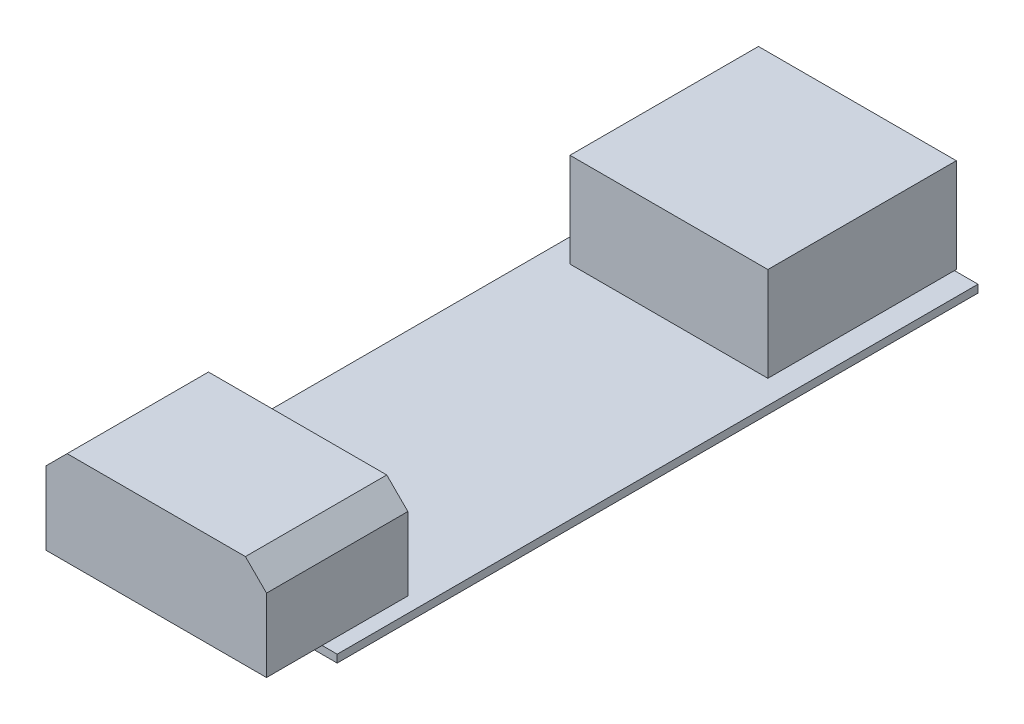
ISO-10303-21;
HEADER;
FILE_DESCRIPTION(('STEP AP214'),'2;1');
FILE_NAME('part.step','',(''),(''),'','','');
FILE_SCHEMA(('AUTOMOTIVE_DESIGN { 1 0 10303 214 1 1 1 1 }'));
ENDSEC;
DATA;
#1=APPLICATION_CONTEXT('core data for automotive mechanical design processes');
#2=APPLICATION_PROTOCOL_DEFINITION('international standard','automotive_design',2000,#1);
#3=PRODUCT_CONTEXT('',#1,'mechanical');
#4=PRODUCT('Part','Part','',(#3));
#5=PRODUCT_RELATED_PRODUCT_CATEGORY('part','',(#4));
#6=PRODUCT_DEFINITION_FORMATION('','',#4);
#7=PRODUCT_DEFINITION_CONTEXT('part definition',#1,'design');
#8=PRODUCT_DEFINITION('design','',#6,#7);
#9=PRODUCT_DEFINITION_SHAPE('','',#8);
#10=(LENGTH_UNIT() NAMED_UNIT(*) SI_UNIT(.MILLI.,.METRE.));
#11=(NAMED_UNIT(*) PLANE_ANGLE_UNIT() SI_UNIT($,.RADIAN.));
#12=(NAMED_UNIT(*) SI_UNIT($,.STERADIAN.) SOLID_ANGLE_UNIT());
#13=UNCERTAINTY_MEASURE_WITH_UNIT(LENGTH_MEASURE(1.E-05),#10,'distance_accuracy_value','');
#14=(GEOMETRIC_REPRESENTATION_CONTEXT(3) GLOBAL_UNCERTAINTY_ASSIGNED_CONTEXT((#13)) GLOBAL_UNIT_ASSIGNED_CONTEXT((#10,
#11,#12)) REPRESENTATION_CONTEXT('',''));
#15=CARTESIAN_POINT('',(0.,0.,0.));
#16=DIRECTION('',(0.,0.,1.));
#17=DIRECTION('',(1.,0.,0.));
#18=AXIS2_PLACEMENT_3D('',#15,#16,#17);
#19=CARTESIAN_POINT('',(0.,0.,0.));
#20=DIRECTION('',(0.,-1.,0.));
#21=DIRECTION('',(0.,0.,-1.));
#22=AXIS2_PLACEMENT_3D('',#19,#20,#21);
#23=PLANE('',#22);
#24=DIRECTION('',(0.,0.,1.));
#25=VECTOR('',#24,1.);
#26=CARTESIAN_POINT('',(0.750000000000004,0.,0.));
#27=LINE('',#26,#25);
#28=CARTESIAN_POINT('',(0.75,0.,-29.45));
#29=VERTEX_POINT('',#28);
#30=CARTESIAN_POINT('',(0.750000000000001,0.,-19.55));
#31=VERTEX_POINT('',#30);
#32=EDGE_CURVE('E11',#29,#31,#27,.T.);
#33=ORIENTED_EDGE('',*,*,#32,.F.);
#34=DIRECTION('',(1.,0.,0.));
#35=VECTOR('',#34,1.);
#36=CARTESIAN_POINT('',(-0.499999999999996,0.,-29.45));
#37=LINE('',#36,#35);
#38=CARTESIAN_POINT('',(-0.499999999999996,0.,-29.45));
#39=VERTEX_POINT('',#38);
#40=EDGE_CURVE('E235',#39,#29,#37,.T.);
#41=ORIENTED_EDGE('',*,*,#40,.F.);
#42=DIRECTION('',(0.,0.,-1.));
#43=VECTOR('',#42,1.);
#44=CARTESIAN_POINT('',(-0.5,0.,4.55));
#45=LINE('',#44,#43);
#46=CARTESIAN_POINT('',(-0.5,0.,4.55));
#47=VERTEX_POINT('',#46);
#48=EDGE_CURVE('E212',#47,#39,#45,.T.);
#49=ORIENTED_EDGE('',*,*,#48,.F.);
#50=DIRECTION('',(-1.,0.,0.));
#51=VECTOR('',#50,1.);
#52=CARTESIAN_POINT('',(-0.5,0.,4.55));
#53=LINE('',#52,#51);
#54=CARTESIAN_POINT('',(0.,0.,4.55));
#55=VERTEX_POINT('',#54);
#56=EDGE_CURVE('E243',#55,#47,#53,.T.);
#57=ORIENTED_EDGE('',*,*,#56,.F.);
#58=DIRECTION('',(0.,0.,-1.));
#59=VECTOR('',#58,1.);
#60=CARTESIAN_POINT('',(0.,0.,7.5));
#61=LINE('',#60,#59);
#62=CARTESIAN_POINT('',(0.,0.,0.));
#63=VERTEX_POINT('',#62);
#64=EDGE_CURVE('E321',#55,#63,#61,.T.);
#65=ORIENTED_EDGE('',*,*,#64,.T.);
#66=DIRECTION('',(1.,0.,0.));
#67=VECTOR('',#66,1.);
#68=CARTESIAN_POINT('',(0.,0.,0.));
#69=LINE('',#68,#67);
#70=CARTESIAN_POINT('',(11.7,0.,0.));
#71=VERTEX_POINT('',#70);
#72=EDGE_CURVE('E287',#63,#71,#69,.T.);
#73=ORIENTED_EDGE('',*,*,#72,.T.);
#74=DIRECTION('',(0.,0.,-1.));
#75=VECTOR('',#74,1.);
#76=CARTESIAN_POINT('',(11.7,0.,7.5));
#77=LINE('',#76,#75);
#78=CARTESIAN_POINT('',(11.7,0.,4.55));
#79=VERTEX_POINT('',#78);
#80=EDGE_CURVE('E317',#79,#71,#77,.T.);
#81=ORIENTED_EDGE('',*,*,#80,.F.);
#82=CARTESIAN_POINT('',(12.5,0.,4.55));
#83=VERTEX_POINT('',#82);
#84=EDGE_CURVE('E221',#83,#79,#53,.T.);
#85=ORIENTED_EDGE('',*,*,#84,.F.);
#86=DIRECTION('',(0.,0.,1.));
#87=VECTOR('',#86,1.);
#88=CARTESIAN_POINT('',(12.5,0.,4.55));
#89=LINE('',#88,#87);
#90=CARTESIAN_POINT('',(12.5,0.,-29.45));
#91=VERTEX_POINT('',#90);
#92=EDGE_CURVE('E239',#91,#83,#89,.T.);
#93=ORIENTED_EDGE('',*,*,#92,.F.);
#94=CARTESIAN_POINT('',(11.25,0.,-29.45));
#95=VERTEX_POINT('',#94);
#96=EDGE_CURVE('E234',#95,#91,#37,.T.);
#97=ORIENTED_EDGE('',*,*,#96,.F.);
#98=DIRECTION('',(0.,0.,-1.));
#99=VECTOR('',#98,1.);
#100=CARTESIAN_POINT('',(11.25,0.,-29.55));
#101=LINE('',#100,#99);
#102=CARTESIAN_POINT('',(11.25,0.,-19.55));
#103=VERTEX_POINT('',#102);
#104=EDGE_CURVE('E59',#103,#95,#101,.T.);
#105=ORIENTED_EDGE('',*,*,#104,.F.);
#106=DIRECTION('',(1.,0.,0.));
#107=VECTOR('',#106,1.);
#108=CARTESIAN_POINT('',(0.750000000000001,0.,-19.55));
#109=LINE('',#108,#107);
#110=EDGE_CURVE('E55',#31,#103,#109,.T.);
#111=ORIENTED_EDGE('',*,*,#110,.F.);
#112=EDGE_LOOP('',(#33,#41,#49,#57,#65,#73,#81,#85,#93,#97,#105,#111));
#113=FACE_BOUND('',#112,.T.);
#114=ADVANCED_FACE('F39',(#113),#23,.F.);
#115=CARTESIAN_POINT('',(0.,0.,7.5));
#116=DIRECTION('',(0.,1.,0.));
#117=DIRECTION('',(0.,0.,1.));
#118=AXIS2_PLACEMENT_3D('',#115,#116,#117);
#119=PLANE('',#118);
#120=EDGE_CURVE('E48',#79,#55,#53,.T.);
#121=ORIENTED_EDGE('',*,*,#120,.F.);
#122=CARTESIAN_POINT('',(11.7,0.,7.5));
#123=VERTEX_POINT('',#122);
#124=EDGE_CURVE('E318',#123,#79,#77,.T.);
#125=ORIENTED_EDGE('',*,*,#124,.F.);
#126=DIRECTION('',(1.,0.,0.));
#127=VECTOR('',#126,1.);
#128=CARTESIAN_POINT('',(0.,0.,7.5));
#129=LINE('',#128,#127);
#130=CARTESIAN_POINT('',(0.,0.,7.5));
#131=VERTEX_POINT('',#130);
#132=EDGE_CURVE('E267',#131,#123,#129,.T.);
#133=ORIENTED_EDGE('',*,*,#132,.F.);
#134=EDGE_CURVE('E322',#131,#55,#61,.T.);
#135=ORIENTED_EDGE('',*,*,#134,.T.);
#136=EDGE_LOOP('',(#121,#125,#133,#135));
#137=FACE_BOUND('',#136,.T.);
#138=ADVANCED_FACE('F522',(#137),#119,.F.);
#139=CARTESIAN_POINT('',(0.,0.,7.5));
#140=DIRECTION('',(1.,0.,0.));
#141=DIRECTION('',(0.,0.,-1.));
#142=AXIS2_PLACEMENT_3D('',#139,#140,#141);
#143=PLANE('',#142);
#144=DIRECTION('',(0.,-1.,0.));
#145=VECTOR('',#144,1.);
#146=CARTESIAN_POINT('',(0.,0.,0.));
#147=LINE('',#146,#145);
#148=CARTESIAN_POINT('',(0.,3.88,0.));
#149=VERTEX_POINT('',#148);
#150=EDGE_CURVE('E262',#149,#63,#147,.T.);
#151=ORIENTED_EDGE('',*,*,#150,.T.);
#152=ORIENTED_EDGE('',*,*,#64,.F.);
#153=ORIENTED_EDGE('',*,*,#134,.F.);
#154=DIRECTION('',(0.,-1.,0.));
#155=VECTOR('',#154,1.);
#156=CARTESIAN_POINT('',(0.,0.,7.5));
#157=LINE('',#156,#155);
#158=CARTESIAN_POINT('',(0.,3.88,7.5));
#159=VERTEX_POINT('',#158);
#160=EDGE_CURVE('E263',#159,#131,#157,.T.);
#161=ORIENTED_EDGE('',*,*,#160,.F.);
#162=DIRECTION('',(0.,0.,-1.));
#163=VECTOR('',#162,1.);
#164=CARTESIAN_POINT('',(0.,3.88,7.5));
#165=LINE('',#164,#163);
#166=EDGE_CURVE('E283',#159,#149,#165,.T.);
#167=ORIENTED_EDGE('',*,*,#166,.T.);
#168=EDGE_LOOP('',(#151,#152,#153,#161,#167));
#169=FACE_BOUND('',#168,.T.);
#170=ADVANCED_FACE('F41',(#169),#143,.F.);
#171=CARTESIAN_POINT('',(11.7,0.,7.5));
#172=DIRECTION('',(-1.,0.,0.));
#173=DIRECTION('',(0.,0.,1.));
#174=AXIS2_PLACEMENT_3D('',#171,#172,#173);
#175=PLANE('',#174);
#176=DIRECTION('',(0.,1.,0.));
#177=VECTOR('',#176,1.);
#178=CARTESIAN_POINT('',(11.7,0.,0.));
#179=LINE('',#178,#177);
#180=CARTESIAN_POINT('',(11.7,3.88,0.));
#181=VERTEX_POINT('',#180);
#182=EDGE_CURVE('E291',#71,#181,#179,.T.);
#183=ORIENTED_EDGE('',*,*,#182,.T.);
#184=DIRECTION('',(0.,0.,-1.));
#185=VECTOR('',#184,1.);
#186=CARTESIAN_POINT('',(11.7,3.88,7.5));
#187=LINE('',#186,#185);
#188=CARTESIAN_POINT('',(11.7,3.88,7.5));
#189=VERTEX_POINT('',#188);
#190=EDGE_CURVE('E313',#189,#181,#187,.T.);
#191=ORIENTED_EDGE('',*,*,#190,.F.);
#192=DIRECTION('',(0.,1.,0.));
#193=VECTOR('',#192,1.);
#194=CARTESIAN_POINT('',(11.7,0.,7.5));
#195=LINE('',#194,#193);
#196=EDGE_CURVE('E271',#123,#189,#195,.T.);
#197=ORIENTED_EDGE('',*,*,#196,.F.);
#198=ORIENTED_EDGE('',*,*,#124,.T.);
#199=ORIENTED_EDGE('',*,*,#80,.T.);
#200=EDGE_LOOP('',(#183,#191,#197,#198,#199));
#201=FACE_BOUND('',#200,.T.);
#202=ADVANCED_FACE('F346',(#201),#175,.F.);
#203=CARTESIAN_POINT('',(10.58,5.,7.5));
#204=DIRECTION('',(-0.707106781186548,-0.707106781186547,0.));
#205=DIRECTION('',(0.707106781186547,-0.707106781186548,0.));
#206=AXIS2_PLACEMENT_3D('',#203,#204,#205);
#207=PLANE('',#206);
#208=DIRECTION('',(-0.707106781186547,0.707106781186548,0.));
#209=VECTOR('',#208,1.);
#210=CARTESIAN_POINT('',(10.58,5.,0.));
#211=LINE('',#210,#209);
#212=CARTESIAN_POINT('',(10.58,5.,0.));
#213=VERTEX_POINT('',#212);
#214=EDGE_CURVE('E294',#181,#213,#211,.T.);
#215=ORIENTED_EDGE('',*,*,#214,.T.);
#216=DIRECTION('',(0.,0.,-1.));
#217=VECTOR('',#216,1.);
#218=CARTESIAN_POINT('',(10.58,5.,7.5));
#219=LINE('',#218,#217);
#220=CARTESIAN_POINT('',(10.58,5.,7.5));
#221=VERTEX_POINT('',#220);
#222=EDGE_CURVE('E309',#221,#213,#219,.T.);
#223=ORIENTED_EDGE('',*,*,#222,.F.);
#224=DIRECTION('',(-0.707106781186547,0.707106781186548,0.));
#225=VECTOR('',#224,1.);
#226=CARTESIAN_POINT('',(10.58,5.,7.5));
#227=LINE('',#226,#225);
#228=EDGE_CURVE('E274',#189,#221,#227,.T.);
#229=ORIENTED_EDGE('',*,*,#228,.F.);
#230=ORIENTED_EDGE('',*,*,#190,.T.);
#231=EDGE_LOOP('',(#215,#223,#229,#230));
#232=FACE_BOUND('',#231,.T.);
#233=ADVANCED_FACE('F350',(#232),#207,.F.);
#234=CARTESIAN_POINT('',(1.12,5.,7.5));
#235=DIRECTION('',(0.,-1.,0.));
#236=DIRECTION('',(0.,0.,-1.));
#237=AXIS2_PLACEMENT_3D('',#234,#235,#236);
#238=PLANE('',#237);
#239=DIRECTION('',(-1.,0.,0.));
#240=VECTOR('',#239,1.);
#241=CARTESIAN_POINT('',(1.12,5.,0.));
#242=LINE('',#241,#240);
#243=CARTESIAN_POINT('',(1.12,5.,0.));
#244=VERTEX_POINT('',#243);
#245=EDGE_CURVE('E297',#213,#244,#242,.T.);
#246=ORIENTED_EDGE('',*,*,#245,.T.);
#247=DIRECTION('',(0.,0.,-1.));
#248=VECTOR('',#247,1.);
#249=CARTESIAN_POINT('',(1.12,5.,7.5));
#250=LINE('',#249,#248);
#251=CARTESIAN_POINT('',(1.12,5.,7.5));
#252=VERTEX_POINT('',#251);
#253=EDGE_CURVE('E305',#252,#244,#250,.T.);
#254=ORIENTED_EDGE('',*,*,#253,.F.);
#255=DIRECTION('',(-1.,0.,0.));
#256=VECTOR('',#255,1.);
#257=CARTESIAN_POINT('',(1.12,5.,7.5));
#258=LINE('',#257,#256);
#259=EDGE_CURVE('E277',#221,#252,#258,.T.);
#260=ORIENTED_EDGE('',*,*,#259,.F.);
#261=ORIENTED_EDGE('',*,*,#222,.T.);
#262=EDGE_LOOP('',(#246,#254,#260,#261));
#263=FACE_BOUND('',#262,.T.);
#264=ADVANCED_FACE('F867',(#263),#238,.F.);
#265=CARTESIAN_POINT('',(0.,3.88,7.5));
#266=DIRECTION('',(0.707106781186548,-0.707106781186547,0.));
#267=DIRECTION('',(0.707106781186547,0.707106781186548,0.));
#268=AXIS2_PLACEMENT_3D('',#265,#266,#267);
#269=PLANE('',#268);
#270=DIRECTION('',(-0.707106781186547,-0.707106781186548,0.));
#271=VECTOR('',#270,1.);
#272=CARTESIAN_POINT('',(0.,3.88,0.));
#273=LINE('',#272,#271);
#274=EDGE_CURVE('E268',#244,#149,#273,.T.);
#275=ORIENTED_EDGE('',*,*,#274,.T.);
#276=ORIENTED_EDGE('',*,*,#166,.F.);
#277=DIRECTION('',(-0.707106781186547,-0.707106781186548,0.));
#278=VECTOR('',#277,1.);
#279=CARTESIAN_POINT('',(0.,3.88,7.5));
#280=LINE('',#279,#278);
#281=EDGE_CURVE('E280',#252,#159,#280,.T.);
#282=ORIENTED_EDGE('',*,*,#281,.F.);
#283=ORIENTED_EDGE('',*,*,#253,.T.);
#284=EDGE_LOOP('',(#275,#276,#282,#283));
#285=FACE_BOUND('',#284,.T.);
#286=ADVANCED_FACE('F859',(#285),#269,.F.);
#287=CARTESIAN_POINT('',(0.,0.,7.5));
#288=DIRECTION('',(0.,0.,-1.));
#289=DIRECTION('',(-1.,0.,0.));
#290=AXIS2_PLACEMENT_3D('',#287,#288,#289);
#291=PLANE('',#290);
#292=ORIENTED_EDGE('',*,*,#160,.T.);
#293=ORIENTED_EDGE('',*,*,#132,.T.);
#294=ORIENTED_EDGE('',*,*,#196,.T.);
#295=ORIENTED_EDGE('',*,*,#228,.T.);
#296=ORIENTED_EDGE('',*,*,#259,.T.);
#297=ORIENTED_EDGE('',*,*,#281,.T.);
#298=EDGE_LOOP('',(#292,#293,#294,#295,#296,#297));
#299=FACE_BOUND('',#298,.T.);
#300=ADVANCED_FACE('F354',(#299),#291,.F.);
#301=CARTESIAN_POINT('',(0.,0.,0.));
#302=DIRECTION('',(0.,0.,-1.));
#303=DIRECTION('',(-1.,0.,0.));
#304=AXIS2_PLACEMENT_3D('',#301,#302,#303);
#305=PLANE('',#304);
#306=ORIENTED_EDGE('',*,*,#150,.F.);
#307=ORIENTED_EDGE('',*,*,#274,.F.);
#308=ORIENTED_EDGE('',*,*,#245,.F.);
#309=ORIENTED_EDGE('',*,*,#214,.F.);
#310=ORIENTED_EDGE('',*,*,#182,.F.);
#311=ORIENTED_EDGE('',*,*,#72,.F.);
#312=EDGE_LOOP('',(#306,#307,#308,#309,#310,#311));
#313=FACE_BOUND('',#312,.T.);
#314=ADVANCED_FACE('F340',(#313),#305,.T.);
#315=CARTESIAN_POINT('',(-0.5,-0.41,4.55));
#316=DIRECTION('',(1.,0.,0.));
#317=DIRECTION('',(0.,0.,-1.));
#318=AXIS2_PLACEMENT_3D('',#315,#316,#317);
#319=PLANE('',#318);
#320=ORIENTED_EDGE('',*,*,#48,.T.);
#321=DIRECTION('',(0.,1.,0.));
#322=VECTOR('',#321,1.);
#323=CARTESIAN_POINT('',(-0.499999999999996,-0.41,-29.45));
#324=LINE('',#323,#322);
#325=CARTESIAN_POINT('',(-0.499999999999996,-0.41,-29.45));
#326=VERTEX_POINT('',#325);
#327=EDGE_CURVE('E258',#326,#39,#324,.T.);
#328=ORIENTED_EDGE('',*,*,#327,.F.);
#329=DIRECTION('',(0.,0.,-1.));
#330=VECTOR('',#329,1.);
#331=CARTESIAN_POINT('',(-0.5,-0.41,4.55));
#332=LINE('',#331,#330);
#333=CARTESIAN_POINT('',(-0.5,-0.41,4.55));
#334=VERTEX_POINT('',#333);
#335=EDGE_CURVE('E216',#334,#326,#332,.T.);
#336=ORIENTED_EDGE('',*,*,#335,.F.);
#337=DIRECTION('',(0.,1.,0.));
#338=VECTOR('',#337,1.);
#339=CARTESIAN_POINT('',(-0.5,-0.41,4.55));
#340=LINE('',#339,#338);
#341=EDGE_CURVE('E230',#334,#47,#340,.T.);
#342=ORIENTED_EDGE('',*,*,#341,.T.);
#343=EDGE_LOOP('',(#320,#328,#336,#342));
#344=FACE_BOUND('',#343,.T.);
#345=ADVANCED_FACE('F509',(#344),#319,.F.);
#346=CARTESIAN_POINT('',(-0.499999999999996,-0.41,-29.45));
#347=DIRECTION('',(0.,0.,1.));
#348=DIRECTION('',(1.,0.,0.));
#349=AXIS2_PLACEMENT_3D('',#346,#347,#348);
#350=PLANE('',#349);
#351=ORIENTED_EDGE('',*,*,#40,.T.);
#352=EDGE_CURVE('E240',#29,#95,#37,.T.);
#353=ORIENTED_EDGE('',*,*,#352,.T.);
#354=ORIENTED_EDGE('',*,*,#96,.T.);
#355=DIRECTION('',(0.,1.,0.));
#356=VECTOR('',#355,1.);
#357=CARTESIAN_POINT('',(12.5,-0.41,-29.45));
#358=LINE('',#357,#356);
#359=CARTESIAN_POINT('',(12.5,-0.41,-29.45));
#360=VERTEX_POINT('',#359);
#361=EDGE_CURVE('E254',#360,#91,#358,.T.);
#362=ORIENTED_EDGE('',*,*,#361,.F.);
#363=DIRECTION('',(1.,0.,0.));
#364=VECTOR('',#363,1.);
#365=CARTESIAN_POINT('',(-0.499999999999996,-0.41,-29.45));
#366=LINE('',#365,#364);
#367=EDGE_CURVE('E220',#326,#360,#366,.T.);
#368=ORIENTED_EDGE('',*,*,#367,.F.);
#369=ORIENTED_EDGE('',*,*,#327,.T.);
#370=EDGE_LOOP('',(#351,#353,#354,#362,#368,#369));
#371=FACE_BOUND('',#370,.T.);
#372=ADVANCED_FACE('F510',(#371),#350,.F.);
#373=CARTESIAN_POINT('',(12.5,-0.41,4.55));
#374=DIRECTION('',(-1.,0.,0.));
#375=DIRECTION('',(0.,0.,1.));
#376=AXIS2_PLACEMENT_3D('',#373,#374,#375);
#377=PLANE('',#376);
#378=ORIENTED_EDGE('',*,*,#92,.T.);
#379=DIRECTION('',(0.,1.,0.));
#380=VECTOR('',#379,1.);
#381=CARTESIAN_POINT('',(12.5,-0.41,4.55));
#382=LINE('',#381,#380);
#383=CARTESIAN_POINT('',(12.5,-0.41,4.55));
#384=VERTEX_POINT('',#383);
#385=EDGE_CURVE('E250',#384,#83,#382,.T.);
#386=ORIENTED_EDGE('',*,*,#385,.F.);
#387=DIRECTION('',(0.,0.,1.));
#388=VECTOR('',#387,1.);
#389=CARTESIAN_POINT('',(12.5,-0.41,4.55));
#390=LINE('',#389,#388);
#391=EDGE_CURVE('E224',#360,#384,#390,.T.);
#392=ORIENTED_EDGE('',*,*,#391,.F.);
#393=ORIENTED_EDGE('',*,*,#361,.T.);
#394=EDGE_LOOP('',(#378,#386,#392,#393));
#395=FACE_BOUND('',#394,.T.);
#396=ADVANCED_FACE('F367',(#395),#377,.F.);
#397=CARTESIAN_POINT('',(-0.5,-0.41,4.55));
#398=DIRECTION('',(0.,0.,-1.));
#399=DIRECTION('',(-1.,0.,0.));
#400=AXIS2_PLACEMENT_3D('',#397,#398,#399);
#401=PLANE('',#400);
#402=ORIENTED_EDGE('',*,*,#84,.T.);
#403=ORIENTED_EDGE('',*,*,#120,.T.);
#404=ORIENTED_EDGE('',*,*,#56,.T.);
#405=ORIENTED_EDGE('',*,*,#341,.F.);
#406=DIRECTION('',(-1.,0.,0.));
#407=VECTOR('',#406,1.);
#408=CARTESIAN_POINT('',(-0.5,-0.41,4.55));
#409=LINE('',#408,#407);
#410=EDGE_CURVE('E227',#384,#334,#409,.T.);
#411=ORIENTED_EDGE('',*,*,#410,.F.);
#412=ORIENTED_EDGE('',*,*,#385,.T.);
#413=EDGE_LOOP('',(#402,#403,#404,#405,#411,#412));
#414=FACE_BOUND('',#413,.T.);
#415=ADVANCED_FACE('F361',(#414),#401,.F.);
#416=CARTESIAN_POINT('',(0.,-0.41,0.));
#417=DIRECTION('',(0.,-1.,0.));
#418=DIRECTION('',(0.,0.,-1.));
#419=AXIS2_PLACEMENT_3D('',#416,#417,#418);
#420=PLANE('',#419);
#421=CARTESIAN_POINT('',(2.2552905137375,-0.41,-21.7));
#422=DIRECTION('',(0.,-1.,0.));
#423=DIRECTION('',(0.,0.,-1.));
#424=AXIS2_PLACEMENT_3D('',#421,#422,#423);
#425=CIRCLE('',#424,0.400000000000001);
#426=CARTESIAN_POINT('',(2.2552905137375,-0.41,-22.1));
#427=VERTEX_POINT('',#426);
#428=EDGE_CURVE('E462',#427,#427,#425,.T.);
#429=ORIENTED_EDGE('',*,*,#428,.F.);
#430=EDGE_LOOP('',(#429));
#431=FACE_BOUND('',#430,.T.);
#432=CARTESIAN_POINT('',(9.7552905137375,-0.41,-21.7));
#433=DIRECTION('',(0.,-1.,0.));
#434=DIRECTION('',(0.,0.,-1.));
#435=AXIS2_PLACEMENT_3D('',#432,#433,#434);
#436=CIRCLE('',#435,0.400000000000002);
#437=CARTESIAN_POINT('',(9.7552905137375,-0.41,-22.1));
#438=VERTEX_POINT('',#437);
#439=EDGE_CURVE('E454',#438,#438,#436,.T.);
#440=ORIENTED_EDGE('',*,*,#439,.F.);
#441=EDGE_LOOP('',(#440));
#442=FACE_BOUND('',#441,.T.);
#443=CARTESIAN_POINT('',(7.2552905137375,-0.41,-21.7));
#444=DIRECTION('',(0.,-1.,0.));
#445=DIRECTION('',(0.,0.,-1.));
#446=AXIS2_PLACEMENT_3D('',#443,#444,#445);
#447=CIRCLE('',#446,0.400000000000001);
#448=CARTESIAN_POINT('',(7.2552905137375,-0.41,-22.1));
#449=VERTEX_POINT('',#448);
#450=EDGE_CURVE('E446',#449,#449,#447,.T.);
#451=ORIENTED_EDGE('',*,*,#450,.F.);
#452=EDGE_LOOP('',(#451));
#453=FACE_BOUND('',#452,.T.);
#454=CARTESIAN_POINT('',(4.7552905137375,-0.41,-21.7));
#455=DIRECTION('',(0.,-1.,0.));
#456=DIRECTION('',(0.,0.,-1.));
#457=AXIS2_PLACEMENT_3D('',#454,#455,#456);
#458=CIRCLE('',#457,0.4);
#459=CARTESIAN_POINT('',(4.7552905137375,-0.41,-22.1));
#460=VERTEX_POINT('',#459);
#461=EDGE_CURVE('E438',#460,#460,#458,.T.);
#462=ORIENTED_EDGE('',*,*,#461,.F.);
#463=EDGE_LOOP('',(#462));
#464=FACE_BOUND('',#463,.T.);
#465=CARTESIAN_POINT('',(9.75529051373752,-0.41,-26.7));
#466=DIRECTION('',(0.,-1.,0.));
#467=DIRECTION('',(0.,0.,-1.));
#468=AXIS2_PLACEMENT_3D('',#465,#466,#467);
#469=CIRCLE('',#468,0.400000000000002);
#470=CARTESIAN_POINT('',(9.75529051373752,-0.41,-27.1));
#471=VERTEX_POINT('',#470);
#472=EDGE_CURVE('E430',#471,#471,#469,.T.);
#473=ORIENTED_EDGE('',*,*,#472,.F.);
#474=EDGE_LOOP('',(#473));
#475=FACE_BOUND('',#474,.T.);
#476=CARTESIAN_POINT('',(7.25529051373752,-0.41,-26.7));
#477=DIRECTION('',(0.,-1.,0.));
#478=DIRECTION('',(0.,0.,-1.));
#479=AXIS2_PLACEMENT_3D('',#476,#477,#478);
#480=CIRCLE('',#479,0.400000000000001);
#481=CARTESIAN_POINT('',(7.25529051373752,-0.41,-27.1));
#482=VERTEX_POINT('',#481);
#483=EDGE_CURVE('E422',#482,#482,#480,.T.);
#484=ORIENTED_EDGE('',*,*,#483,.F.);
#485=EDGE_LOOP('',(#484));
#486=FACE_BOUND('',#485,.T.);
#487=CARTESIAN_POINT('',(4.75529051373752,-0.41,-26.7));
#488=DIRECTION('',(0.,-1.,0.));
#489=DIRECTION('',(0.,0.,-1.));
#490=AXIS2_PLACEMENT_3D('',#487,#488,#489);
#491=CIRCLE('',#490,0.4);
#492=CARTESIAN_POINT('',(4.75529051373752,-0.41,-27.1));
#493=VERTEX_POINT('',#492);
#494=EDGE_CURVE('E414',#493,#493,#491,.T.);
#495=ORIENTED_EDGE('',*,*,#494,.F.);
#496=EDGE_LOOP('',(#495));
#497=FACE_BOUND('',#496,.T.);
#498=CARTESIAN_POINT('',(2.25529051373752,-0.41,-26.7));
#499=DIRECTION('',(0.,-1.,0.));
#500=DIRECTION('',(0.,0.,-1.));
#501=AXIS2_PLACEMENT_3D('',#498,#499,#500);
#502=CIRCLE('',#501,0.400000000000001);
#503=CARTESIAN_POINT('',(2.25529051373752,-0.41,-27.1));
#504=VERTEX_POINT('',#503);
#505=EDGE_CURVE('E405',#504,#504,#502,.T.);
#506=ORIENTED_EDGE('',*,*,#505,.F.);
#507=EDGE_LOOP('',(#506));
#508=FACE_BOUND('',#507,.T.);
#509=CARTESIAN_POINT('',(9.75529051373752,-0.41,0.299999999999999));
#510=DIRECTION('',(0.,-1.,0.));
#511=DIRECTION('',(0.,0.,-1.));
#512=AXIS2_PLACEMENT_3D('',#509,#510,#511);
#513=CIRCLE('',#512,0.3);
#514=CARTESIAN_POINT('',(9.75529051373752,-0.41,0.));
#515=VERTEX_POINT('',#514);
#516=EDGE_CURVE('E177',#515,#515,#513,.T.);
#517=ORIENTED_EDGE('',*,*,#516,.F.);
#518=EDGE_LOOP('',(#517));
#519=FACE_BOUND('',#518,.T.);
#520=CARTESIAN_POINT('',(7.25529051373752,-0.41,0.299999999999999));
#521=DIRECTION('',(0.,-1.,0.));
#522=DIRECTION('',(0.,0.,-1.));
#523=AXIS2_PLACEMENT_3D('',#520,#521,#522);
#524=CIRCLE('',#523,0.3);
#525=CARTESIAN_POINT('',(7.25529051373752,-0.41,0.));
#526=VERTEX_POINT('',#525);
#527=EDGE_CURVE('E190',#526,#526,#524,.T.);
#528=ORIENTED_EDGE('',*,*,#527,.F.);
#529=EDGE_LOOP('',(#528));
#530=FACE_BOUND('',#529,.T.);
#531=CARTESIAN_POINT('',(4.75529051373752,-0.41,0.299999999999999));
#532=DIRECTION('',(0.,-1.,0.));
#533=DIRECTION('',(0.,0.,-1.));
#534=AXIS2_PLACEMENT_3D('',#531,#532,#533);
#535=CIRCLE('',#534,0.3);
#536=CARTESIAN_POINT('',(4.75529051373752,-0.41,0.));
#537=VERTEX_POINT('',#536);
#538=EDGE_CURVE('E196',#537,#537,#535,.T.);
#539=ORIENTED_EDGE('',*,*,#538,.F.);
#540=EDGE_LOOP('',(#539));
#541=FACE_BOUND('',#540,.T.);
#542=CARTESIAN_POINT('',(2.25529051373752,-0.41,0.299999999999999));
#543=DIRECTION('',(0.,-1.,0.));
#544=DIRECTION('',(0.,0.,-1.));
#545=AXIS2_PLACEMENT_3D('',#542,#543,#544);
#546=CIRCLE('',#545,0.3);
#547=CARTESIAN_POINT('',(2.25529051373752,-0.41,0.));
#548=VERTEX_POINT('',#547);
#549=EDGE_CURVE('E204',#548,#548,#546,.T.);
#550=ORIENTED_EDGE('',*,*,#549,.F.);
#551=EDGE_LOOP('',(#550));
#552=FACE_BOUND('',#551,.T.);
#553=ORIENTED_EDGE('',*,*,#335,.T.);
#554=ORIENTED_EDGE('',*,*,#367,.T.);
#555=ORIENTED_EDGE('',*,*,#391,.T.);
#556=ORIENTED_EDGE('',*,*,#410,.T.);
#557=EDGE_LOOP('',(#553,#554,#555,#556));
#558=FACE_BOUND('',#557,.T.);
#559=ADVANCED_FACE('F479',(#431,#442,#453,#464,#475,#486,#497,#508,#519,#530,#541,#552,#558),
#420,.T.);
#560=CARTESIAN_POINT('',(2.25529051373752,-2.1,0.299999999999999));
#561=DIRECTION('',(0.,1.,0.));
#562=DIRECTION('',(0.,0.,1.));
#563=AXIS2_PLACEMENT_3D('',#560,#561,#562);
#564=CYLINDRICAL_SURFACE('',#563,0.3);
#565=CARTESIAN_POINT('',(2.25529051373752,-2.1,0.299999999999999));
#566=DIRECTION('',(0.,-1.,0.));
#567=DIRECTION('',(0.,0.,-1.));
#568=AXIS2_PLACEMENT_3D('',#565,#566,#567);
#569=CIRCLE('',#568,0.3);
#570=CARTESIAN_POINT('',(2.25529051373752,-2.1,0.));
#571=VERTEX_POINT('',#570);
#572=EDGE_CURVE('E208',#571,#571,#569,.T.);
#573=ORIENTED_EDGE('',*,*,#572,.F.);
#574=EDGE_LOOP('',(#573));
#575=FACE_BOUND('',#574,.T.);
#576=ORIENTED_EDGE('',*,*,#549,.T.);
#577=EDGE_LOOP('',(#576));
#578=FACE_BOUND('',#577,.T.);
#579=ADVANCED_FACE('F482',(#575,#578),#564,.T.);
#580=CARTESIAN_POINT('',(2.25529051373752,-2.1,0.299999999999999));
#581=DIRECTION('',(0.,-1.,0.));
#582=DIRECTION('',(0.,0.,-1.));
#583=AXIS2_PLACEMENT_3D('',#580,#581,#582);
#584=PLANE('',#583);
#585=ORIENTED_EDGE('',*,*,#572,.T.);
#586=EDGE_LOOP('',(#585));
#587=FACE_BOUND('',#586,.T.);
#588=ADVANCED_FACE('F546',(#587),#584,.T.);
#589=CARTESIAN_POINT('',(4.75529051373752,-2.1,0.299999999999999));
#590=DIRECTION('',(0.,1.,0.));
#591=DIRECTION('',(0.,0.,1.));
#592=AXIS2_PLACEMENT_3D('',#589,#590,#591);
#593=CYLINDRICAL_SURFACE('',#592,0.3);
#594=CARTESIAN_POINT('',(4.75529051373752,-2.1,0.299999999999999));
#595=DIRECTION('',(0.,-1.,0.));
#596=DIRECTION('',(0.,0.,-1.));
#597=AXIS2_PLACEMENT_3D('',#594,#595,#596);
#598=CIRCLE('',#597,0.3);
#599=CARTESIAN_POINT('',(4.75529051373752,-2.1,0.));
#600=VERTEX_POINT('',#599);
#601=EDGE_CURVE('E200',#600,#600,#598,.T.);
#602=ORIENTED_EDGE('',*,*,#601,.F.);
#603=EDGE_LOOP('',(#602));
#604=FACE_BOUND('',#603,.T.);
#605=ORIENTED_EDGE('',*,*,#538,.T.);
#606=EDGE_LOOP('',(#605));
#607=FACE_BOUND('',#606,.T.);
#608=ADVANCED_FACE('F553',(#604,#607),#593,.T.);
#609=CARTESIAN_POINT('',(4.75529051373752,-2.1,0.299999999999999));
#610=DIRECTION('',(0.,-1.,0.));
#611=DIRECTION('',(0.,0.,-1.));
#612=AXIS2_PLACEMENT_3D('',#609,#610,#611);
#613=PLANE('',#612);
#614=ORIENTED_EDGE('',*,*,#601,.T.);
#615=EDGE_LOOP('',(#614));
#616=FACE_BOUND('',#615,.T.);
#617=ADVANCED_FACE('F561',(#616),#613,.T.);
#618=CARTESIAN_POINT('',(7.25529051373752,-2.1,0.299999999999999));
#619=DIRECTION('',(0.,1.,0.));
#620=DIRECTION('',(0.,0.,1.));
#621=AXIS2_PLACEMENT_3D('',#618,#619,#620);
#622=CYLINDRICAL_SURFACE('',#621,0.3);
#623=CARTESIAN_POINT('',(7.25529051373752,-2.1,0.299999999999999));
#624=DIRECTION('',(0.,-1.,0.));
#625=DIRECTION('',(0.,0.,-1.));
#626=AXIS2_PLACEMENT_3D('',#623,#624,#625);
#627=CIRCLE('',#626,0.3);
#628=CARTESIAN_POINT('',(7.25529051373752,-2.1,0.));
#629=VERTEX_POINT('',#628);
#630=EDGE_CURVE('E192',#629,#629,#627,.T.);
#631=ORIENTED_EDGE('',*,*,#630,.F.);
#632=EDGE_LOOP('',(#631));
#633=FACE_BOUND('',#632,.T.);
#634=ORIENTED_EDGE('',*,*,#527,.T.);
#635=EDGE_LOOP('',(#634));
#636=FACE_BOUND('',#635,.T.);
#637=ADVANCED_FACE('F569',(#633,#636),#622,.T.);
#638=CARTESIAN_POINT('',(7.25529051373752,-2.1,0.299999999999999));
#639=DIRECTION('',(0.,-1.,0.));
#640=DIRECTION('',(0.,0.,-1.));
#641=AXIS2_PLACEMENT_3D('',#638,#639,#640);
#642=PLANE('',#641);
#643=ORIENTED_EDGE('',*,*,#630,.T.);
#644=EDGE_LOOP('',(#643));
#645=FACE_BOUND('',#644,.T.);
#646=ADVANCED_FACE('F577',(#645),#642,.T.);
#647=CARTESIAN_POINT('',(9.75529051373752,-2.1,0.299999999999999));
#648=DIRECTION('',(0.,1.,0.));
#649=DIRECTION('',(0.,0.,1.));
#650=AXIS2_PLACEMENT_3D('',#647,#648,#649);
#651=CYLINDRICAL_SURFACE('',#650,0.3);
#652=CARTESIAN_POINT('',(9.75529051373752,-2.1,0.299999999999999));
#653=DIRECTION('',(0.,-1.,0.));
#654=DIRECTION('',(0.,0.,-1.));
#655=AXIS2_PLACEMENT_3D('',#652,#653,#654);
#656=CIRCLE('',#655,0.3);
#657=CARTESIAN_POINT('',(9.75529051373752,-2.1,0.));
#658=VERTEX_POINT('',#657);
#659=EDGE_CURVE('E182',#658,#658,#656,.T.);
#660=ORIENTED_EDGE('',*,*,#659,.F.);
#661=EDGE_LOOP('',(#660));
#662=FACE_BOUND('',#661,.T.);
#663=ORIENTED_EDGE('',*,*,#516,.T.);
#664=EDGE_LOOP('',(#663));
#665=FACE_BOUND('',#664,.T.);
#666=ADVANCED_FACE('F585',(#662,#665),#651,.T.);
#667=CARTESIAN_POINT('',(9.75529051373752,-2.1,0.299999999999999));
#668=DIRECTION('',(0.,-1.,0.));
#669=DIRECTION('',(0.,0.,-1.));
#670=AXIS2_PLACEMENT_3D('',#667,#668,#669);
#671=PLANE('',#670);
#672=ORIENTED_EDGE('',*,*,#659,.T.);
#673=EDGE_LOOP('',(#672));
#674=FACE_BOUND('',#673,.T.);
#675=ADVANCED_FACE('F593',(#674),#671,.T.);
#676=CARTESIAN_POINT('',(0.,0.,0.));
#677=DIRECTION('',(0.,1.,0.));
#678=DIRECTION('',(0.,0.,1.));
#679=AXIS2_PLACEMENT_3D('',#676,#677,#678);
#680=PLANE('',#679);
#681=CARTESIAN_POINT('',(11.25,0.,-29.55));
#682=VERTEX_POINT('',#681);
#683=EDGE_CURVE('E375',#95,#682,#101,.T.);
#684=ORIENTED_EDGE('',*,*,#683,.F.);
#685=ORIENTED_EDGE('',*,*,#352,.F.);
#686=DIRECTION('',(0.,0.,1.));
#687=VECTOR('',#686,1.);
#688=CARTESIAN_POINT('',(0.75,0.,-29.55));
#689=LINE('',#688,#687);
#690=CARTESIAN_POINT('',(0.75,0.,-29.55));
#691=VERTEX_POINT('',#690);
#692=EDGE_CURVE('E399',#691,#29,#689,.T.);
#693=ORIENTED_EDGE('',*,*,#692,.F.);
#694=DIRECTION('',(-1.,0.,0.));
#695=VECTOR('',#694,1.);
#696=CARTESIAN_POINT('',(0.75,0.,-29.55));
#697=LINE('',#696,#695);
#698=EDGE_CURVE('E172',#682,#691,#697,.T.);
#699=ORIENTED_EDGE('',*,*,#698,.F.);
#700=EDGE_LOOP('',(#684,#685,#693,#699));
#701=FACE_BOUND('',#700,.T.);
#702=ADVANCED_FACE('F376',(#701),#680,.F.);
#703=CARTESIAN_POINT('',(0.75,5.,-29.55));
#704=DIRECTION('',(1.,0.,0.));
#705=DIRECTION('',(0.,0.,-1.));
#706=AXIS2_PLACEMENT_3D('',#703,#704,#705);
#707=PLANE('',#706);
#708=ORIENTED_EDGE('',*,*,#692,.T.);
#709=ORIENTED_EDGE('',*,*,#32,.T.);
#710=DIRECTION('',(0.,-1.,0.));
#711=VECTOR('',#710,1.);
#712=CARTESIAN_POINT('',(0.750000000000001,5.,-19.55));
#713=LINE('',#712,#711);
#714=CARTESIAN_POINT('',(0.750000000000001,5.,-19.55));
#715=VERTEX_POINT('',#714);
#716=EDGE_CURVE('E155',#715,#31,#713,.T.);
#717=ORIENTED_EDGE('',*,*,#716,.F.);
#718=DIRECTION('',(0.,0.,1.));
#719=VECTOR('',#718,1.);
#720=CARTESIAN_POINT('',(0.75,5.,-29.55));
#721=LINE('',#720,#719);
#722=CARTESIAN_POINT('',(0.75,5.,-29.55));
#723=VERTEX_POINT('',#722);
#724=EDGE_CURVE('E162',#723,#715,#721,.T.);
#725=ORIENTED_EDGE('',*,*,#724,.F.);
#726=DIRECTION('',(0.,-1.,0.));
#727=VECTOR('',#726,1.);
#728=CARTESIAN_POINT('',(0.75,5.,-29.55));
#729=LINE('',#728,#727);
#730=EDGE_CURVE('E390',#723,#691,#729,.T.);
#731=ORIENTED_EDGE('',*,*,#730,.T.);
#732=EDGE_LOOP('',(#708,#709,#717,#725,#731));
#733=FACE_BOUND('',#732,.T.);
#734=ADVANCED_FACE('F175',(#733),#707,.F.);
#735=CARTESIAN_POINT('',(0.750000000000001,5.,-19.55));
#736=DIRECTION('',(0.,0.,-1.));
#737=DIRECTION('',(-1.,0.,0.));
#738=AXIS2_PLACEMENT_3D('',#735,#736,#737);
#739=PLANE('',#738);
#740=ORIENTED_EDGE('',*,*,#110,.T.);
#741=DIRECTION('',(0.,-1.,0.));
#742=VECTOR('',#741,1.);
#743=CARTESIAN_POINT('',(11.25,5.,-19.55));
#744=LINE('',#743,#742);
#745=CARTESIAN_POINT('',(11.25,5.,-19.55));
#746=VERTEX_POINT('',#745);
#747=EDGE_CURVE('E157',#746,#103,#744,.T.);
#748=ORIENTED_EDGE('',*,*,#747,.F.);
#749=DIRECTION('',(1.,0.,0.));
#750=VECTOR('',#749,1.);
#751=CARTESIAN_POINT('',(0.750000000000001,5.,-19.55));
#752=LINE('',#751,#750);
#753=EDGE_CURVE('E151',#715,#746,#752,.T.);
#754=ORIENTED_EDGE('',*,*,#753,.F.);
#755=ORIENTED_EDGE('',*,*,#716,.T.);
#756=EDGE_LOOP('',(#740,#748,#754,#755));
#757=FACE_BOUND('',#756,.T.);
#758=ADVANCED_FACE('F153',(#757),#739,.F.);
#759=CARTESIAN_POINT('',(11.25,5.,-29.55));
#760=DIRECTION('',(-1.,0.,0.));
#761=DIRECTION('',(0.,0.,1.));
#762=AXIS2_PLACEMENT_3D('',#759,#760,#761);
#763=PLANE('',#762);
#764=ORIENTED_EDGE('',*,*,#104,.T.);
#765=ORIENTED_EDGE('',*,*,#683,.T.);
#766=DIRECTION('',(0.,-1.,0.));
#767=VECTOR('',#766,1.);
#768=CARTESIAN_POINT('',(11.25,5.,-29.55));
#769=LINE('',#768,#767);
#770=CARTESIAN_POINT('',(11.25,5.,-29.55));
#771=VERTEX_POINT('',#770);
#772=EDGE_CURVE('E184',#771,#682,#769,.T.);
#773=ORIENTED_EDGE('',*,*,#772,.F.);
#774=DIRECTION('',(0.,0.,-1.));
#775=VECTOR('',#774,1.);
#776=CARTESIAN_POINT('',(11.25,5.,-29.55));
#777=LINE('',#776,#775);
#778=EDGE_CURVE('E161',#746,#771,#777,.T.);
#779=ORIENTED_EDGE('',*,*,#778,.F.);
#780=ORIENTED_EDGE('',*,*,#747,.T.);
#781=EDGE_LOOP('',(#764,#765,#773,#779,#780));
#782=FACE_BOUND('',#781,.T.);
#783=ADVANCED_FACE('F383',(#782),#763,.F.);
#784=CARTESIAN_POINT('',(0.75,5.,-29.55));
#785=DIRECTION('',(0.,0.,1.));
#786=DIRECTION('',(1.,0.,0.));
#787=AXIS2_PLACEMENT_3D('',#784,#785,#786);
#788=PLANE('',#787);
#789=ORIENTED_EDGE('',*,*,#698,.T.);
#790=ORIENTED_EDGE('',*,*,#730,.F.);
#791=DIRECTION('',(-1.,0.,0.));
#792=VECTOR('',#791,1.);
#793=CARTESIAN_POINT('',(0.75,5.,-29.55));
#794=LINE('',#793,#792);
#795=EDGE_CURVE('E167',#771,#723,#794,.T.);
#796=ORIENTED_EDGE('',*,*,#795,.F.);
#797=ORIENTED_EDGE('',*,*,#772,.T.);
#798=EDGE_LOOP('',(#789,#790,#796,#797));
#799=FACE_BOUND('',#798,.T.);
#800=ADVANCED_FACE('F394',(#799),#788,.F.);
#801=CARTESIAN_POINT('',(0.,5.,0.));
#802=DIRECTION('',(0.,1.,0.));
#803=DIRECTION('',(0.,0.,1.));
#804=AXIS2_PLACEMENT_3D('',#801,#802,#803);
#805=PLANE('',#804);
#806=ORIENTED_EDGE('',*,*,#724,.T.);
#807=ORIENTED_EDGE('',*,*,#753,.T.);
#808=ORIENTED_EDGE('',*,*,#778,.T.);
#809=ORIENTED_EDGE('',*,*,#795,.T.);
#810=EDGE_LOOP('',(#806,#807,#808,#809));
#811=FACE_BOUND('',#810,.T.);
#812=ADVANCED_FACE('F165',(#811),#805,.T.);
#813=CARTESIAN_POINT('',(2.25529051373752,-2.11,-26.7));
#814=DIRECTION('',(0.,1.,0.));
#815=DIRECTION('',(0.,0.,1.));
#816=AXIS2_PLACEMENT_3D('',#813,#814,#815);
#817=CYLINDRICAL_SURFACE('',#816,0.400000000000001);
#818=CARTESIAN_POINT('',(2.25529051373752,-2.11,-26.7));
#819=DIRECTION('',(0.,-1.,0.));
#820=DIRECTION('',(0.,0.,-1.));
#821=AXIS2_PLACEMENT_3D('',#818,#819,#820);
#822=CIRCLE('',#821,0.400000000000001);
#823=CARTESIAN_POINT('',(2.25529051373752,-2.11,-27.1));
#824=VERTEX_POINT('',#823);
#825=EDGE_CURVE('E401',#824,#824,#822,.T.);
#826=ORIENTED_EDGE('',*,*,#825,.F.);
#827=EDGE_LOOP('',(#826));
#828=FACE_BOUND('',#827,.T.);
#829=ORIENTED_EDGE('',*,*,#505,.T.);
#830=EDGE_LOOP('',(#829));
#831=FACE_BOUND('',#830,.T.);
#832=ADVANCED_FACE('F637',(#828,#831),#817,.T.);
#833=CARTESIAN_POINT('',(2.25529051373752,-2.11,-26.7));
#834=DIRECTION('',(0.,-1.,0.));
#835=DIRECTION('',(0.,0.,-1.));
#836=AXIS2_PLACEMENT_3D('',#833,#834,#835);
#837=PLANE('',#836);
#838=ORIENTED_EDGE('',*,*,#825,.T.);
#839=EDGE_LOOP('',(#838));
#840=FACE_BOUND('',#839,.T.);
#841=ADVANCED_FACE('F643',(#840),#837,.T.);
#842=CARTESIAN_POINT('',(4.75529051373752,-2.11,-26.7));
#843=DIRECTION('',(0.,1.,0.));
#844=DIRECTION('',(0.,0.,1.));
#845=AXIS2_PLACEMENT_3D('',#842,#843,#844);
#846=CYLINDRICAL_SURFACE('',#845,0.4);
#847=CARTESIAN_POINT('',(4.75529051373752,-2.11,-26.7));
#848=DIRECTION('',(0.,-1.,0.));
#849=DIRECTION('',(0.,0.,-1.));
#850=AXIS2_PLACEMENT_3D('',#847,#848,#849);
#851=CIRCLE('',#850,0.4);
#852=CARTESIAN_POINT('',(4.75529051373752,-2.11,-27.1));
#853=VERTEX_POINT('',#852);
#854=EDGE_CURVE('E411',#853,#853,#851,.T.);
#855=ORIENTED_EDGE('',*,*,#854,.F.);
#856=EDGE_LOOP('',(#855));
#857=FACE_BOUND('',#856,.T.);
#858=ORIENTED_EDGE('',*,*,#494,.T.);
#859=EDGE_LOOP('',(#858));
#860=FACE_BOUND('',#859,.T.);
#861=ADVANCED_FACE('F651',(#857,#860),#846,.T.);
#862=CARTESIAN_POINT('',(4.75529051373752,-2.11,-26.7));
#863=DIRECTION('',(0.,-1.,0.));
#864=DIRECTION('',(0.,0.,-1.));
#865=AXIS2_PLACEMENT_3D('',#862,#863,#864);
#866=PLANE('',#865);
#867=ORIENTED_EDGE('',*,*,#854,.T.);
#868=EDGE_LOOP('',(#867));
#869=FACE_BOUND('',#868,.T.);
#870=ADVANCED_FACE('F658',(#869),#866,.T.);
#871=CARTESIAN_POINT('',(7.25529051373752,-2.11,-26.7));
#872=DIRECTION('',(0.,1.,0.));
#873=DIRECTION('',(0.,0.,1.));
#874=AXIS2_PLACEMENT_3D('',#871,#872,#873);
#875=CYLINDRICAL_SURFACE('',#874,0.400000000000001);
#876=CARTESIAN_POINT('',(7.25529051373752,-2.11,-26.7));
#877=DIRECTION('',(0.,-1.,0.));
#878=DIRECTION('',(0.,0.,-1.));
#879=AXIS2_PLACEMENT_3D('',#876,#877,#878);
#880=CIRCLE('',#879,0.400000000000001);
#881=CARTESIAN_POINT('',(7.25529051373752,-2.11,-27.1));
#882=VERTEX_POINT('',#881);
#883=EDGE_CURVE('E418',#882,#882,#880,.T.);
#884=ORIENTED_EDGE('',*,*,#883,.F.);
#885=EDGE_LOOP('',(#884));
#886=FACE_BOUND('',#885,.T.);
#887=ORIENTED_EDGE('',*,*,#483,.T.);
#888=EDGE_LOOP('',(#887));
#889=FACE_BOUND('',#888,.T.);
#890=ADVANCED_FACE('F666',(#886,#889),#875,.T.);
#891=CARTESIAN_POINT('',(7.25529051373752,-2.11,-26.7));
#892=DIRECTION('',(0.,-1.,0.));
#893=DIRECTION('',(0.,0.,-1.));
#894=AXIS2_PLACEMENT_3D('',#891,#892,#893);
#895=PLANE('',#894);
#896=ORIENTED_EDGE('',*,*,#883,.T.);
#897=EDGE_LOOP('',(#896));
#898=FACE_BOUND('',#897,.T.);
#899=ADVANCED_FACE('F674',(#898),#895,.T.);
#900=CARTESIAN_POINT('',(9.75529051373752,-2.11,-26.7));
#901=DIRECTION('',(0.,1.,0.));
#902=DIRECTION('',(0.,0.,1.));
#903=AXIS2_PLACEMENT_3D('',#900,#901,#902);
#904=CYLINDRICAL_SURFACE('',#903,0.400000000000002);
#905=CARTESIAN_POINT('',(9.75529051373752,-2.11,-26.7));
#906=DIRECTION('',(0.,-1.,0.));
#907=DIRECTION('',(0.,0.,-1.));
#908=AXIS2_PLACEMENT_3D('',#905,#906,#907);
#909=CIRCLE('',#908,0.400000000000002);
#910=CARTESIAN_POINT('',(9.75529051373752,-2.11,-27.1));
#911=VERTEX_POINT('',#910);
#912=EDGE_CURVE('E426',#911,#911,#909,.T.);
#913=ORIENTED_EDGE('',*,*,#912,.F.);
#914=EDGE_LOOP('',(#913));
#915=FACE_BOUND('',#914,.T.);
#916=ORIENTED_EDGE('',*,*,#472,.T.);
#917=EDGE_LOOP('',(#916));
#918=FACE_BOUND('',#917,.T.);
#919=ADVANCED_FACE('F682',(#915,#918),#904,.T.);
#920=CARTESIAN_POINT('',(9.75529051373752,-2.11,-26.7));
#921=DIRECTION('',(0.,-1.,0.));
#922=DIRECTION('',(0.,0.,-1.));
#923=AXIS2_PLACEMENT_3D('',#920,#921,#922);
#924=PLANE('',#923);
#925=ORIENTED_EDGE('',*,*,#912,.T.);
#926=EDGE_LOOP('',(#925));
#927=FACE_BOUND('',#926,.T.);
#928=ADVANCED_FACE('F690',(#927),#924,.T.);
#929=CARTESIAN_POINT('',(4.7552905137375,-2.11,-21.7));
#930=DIRECTION('',(0.,1.,0.));
#931=DIRECTION('',(0.,0.,1.));
#932=AXIS2_PLACEMENT_3D('',#929,#930,#931);
#933=CYLINDRICAL_SURFACE('',#932,0.4);
#934=CARTESIAN_POINT('',(4.7552905137375,-2.11,-21.7));
#935=DIRECTION('',(0.,-1.,0.));
#936=DIRECTION('',(0.,0.,-1.));
#937=AXIS2_PLACEMENT_3D('',#934,#935,#936);
#938=CIRCLE('',#937,0.4);
#939=CARTESIAN_POINT('',(4.7552905137375,-2.11,-22.1));
#940=VERTEX_POINT('',#939);
#941=EDGE_CURVE('E434',#940,#940,#938,.T.);
#942=ORIENTED_EDGE('',*,*,#941,.F.);
#943=EDGE_LOOP('',(#942));
#944=FACE_BOUND('',#943,.T.);
#945=ORIENTED_EDGE('',*,*,#461,.T.);
#946=EDGE_LOOP('',(#945));
#947=FACE_BOUND('',#946,.T.);
#948=ADVANCED_FACE('F698',(#944,#947),#933,.T.);
#949=CARTESIAN_POINT('',(4.7552905137375,-2.11,-21.7));
#950=DIRECTION('',(0.,-1.,0.));
#951=DIRECTION('',(0.,0.,-1.));
#952=AXIS2_PLACEMENT_3D('',#949,#950,#951);
#953=PLANE('',#952);
#954=ORIENTED_EDGE('',*,*,#941,.T.);
#955=EDGE_LOOP('',(#954));
#956=FACE_BOUND('',#955,.T.);
#957=ADVANCED_FACE('F706',(#956),#953,.T.);
#958=CARTESIAN_POINT('',(7.2552905137375,-2.11,-21.7));
#959=DIRECTION('',(0.,1.,0.));
#960=DIRECTION('',(0.,0.,1.));
#961=AXIS2_PLACEMENT_3D('',#958,#959,#960);
#962=CYLINDRICAL_SURFACE('',#961,0.400000000000001);
#963=CARTESIAN_POINT('',(7.2552905137375,-2.11,-21.7));
#964=DIRECTION('',(0.,-1.,0.));
#965=DIRECTION('',(0.,0.,-1.));
#966=AXIS2_PLACEMENT_3D('',#963,#964,#965);
#967=CIRCLE('',#966,0.400000000000001);
#968=CARTESIAN_POINT('',(7.2552905137375,-2.11,-22.1));
#969=VERTEX_POINT('',#968);
#970=EDGE_CURVE('E442',#969,#969,#967,.T.);
#971=ORIENTED_EDGE('',*,*,#970,.F.);
#972=EDGE_LOOP('',(#971));
#973=FACE_BOUND('',#972,.T.);
#974=ORIENTED_EDGE('',*,*,#450,.T.);
#975=EDGE_LOOP('',(#974));
#976=FACE_BOUND('',#975,.T.);
#977=ADVANCED_FACE('F714',(#973,#976),#962,.T.);
#978=CARTESIAN_POINT('',(7.2552905137375,-2.11,-21.7));
#979=DIRECTION('',(0.,-1.,0.));
#980=DIRECTION('',(0.,0.,-1.));
#981=AXIS2_PLACEMENT_3D('',#978,#979,#980);
#982=PLANE('',#981);
#983=ORIENTED_EDGE('',*,*,#970,.T.);
#984=EDGE_LOOP('',(#983));
#985=FACE_BOUND('',#984,.T.);
#986=ADVANCED_FACE('F722',(#985),#982,.T.);
#987=CARTESIAN_POINT('',(9.7552905137375,-2.11,-21.7));
#988=DIRECTION('',(0.,1.,0.));
#989=DIRECTION('',(0.,0.,1.));
#990=AXIS2_PLACEMENT_3D('',#987,#988,#989);
#991=CYLINDRICAL_SURFACE('',#990,0.400000000000002);
#992=CARTESIAN_POINT('',(9.7552905137375,-2.11,-21.7));
#993=DIRECTION('',(0.,-1.,0.));
#994=DIRECTION('',(0.,0.,-1.));
#995=AXIS2_PLACEMENT_3D('',#992,#993,#994);
#996=CIRCLE('',#995,0.400000000000002);
#997=CARTESIAN_POINT('',(9.7552905137375,-2.11,-22.1));
#998=VERTEX_POINT('',#997);
#999=EDGE_CURVE('E450',#998,#998,#996,.T.);
#1000=ORIENTED_EDGE('',*,*,#999,.F.);
#1001=EDGE_LOOP('',(#1000));
#1002=FACE_BOUND('',#1001,.T.);
#1003=ORIENTED_EDGE('',*,*,#439,.T.);
#1004=EDGE_LOOP('',(#1003));
#1005=FACE_BOUND('',#1004,.T.);
#1006=ADVANCED_FACE('F730',(#1002,#1005),#991,.T.);
#1007=CARTESIAN_POINT('',(9.7552905137375,-2.11,-21.7));
#1008=DIRECTION('',(0.,-1.,0.));
#1009=DIRECTION('',(0.,0.,-1.));
#1010=AXIS2_PLACEMENT_3D('',#1007,#1008,#1009);
#1011=PLANE('',#1010);
#1012=ORIENTED_EDGE('',*,*,#999,.T.);
#1013=EDGE_LOOP('',(#1012));
#1014=FACE_BOUND('',#1013,.T.);
#1015=ADVANCED_FACE('F475',(#1014),#1011,.T.);
#1016=CARTESIAN_POINT('',(2.2552905137375,-2.11,-21.7));
#1017=DIRECTION('',(0.,1.,0.));
#1018=DIRECTION('',(0.,0.,1.));
#1019=AXIS2_PLACEMENT_3D('',#1016,#1017,#1018);
#1020=CYLINDRICAL_SURFACE('',#1019,0.400000000000001);
#1021=CARTESIAN_POINT('',(2.2552905137375,-2.11,-21.7));
#1022=DIRECTION('',(0.,-1.,0.));
#1023=DIRECTION('',(0.,0.,-1.));
#1024=AXIS2_PLACEMENT_3D('',#1021,#1022,#1023);
#1025=CIRCLE('',#1024,0.400000000000001);
#1026=CARTESIAN_POINT('',(2.2552905137375,-2.11,-22.1));
#1027=VERTEX_POINT('',#1026);
#1028=EDGE_CURVE('E458',#1027,#1027,#1025,.T.);
#1029=ORIENTED_EDGE('',*,*,#1028,.F.);
#1030=EDGE_LOOP('',(#1029));
#1031=FACE_BOUND('',#1030,.T.);
#1032=ORIENTED_EDGE('',*,*,#428,.T.);
#1033=EDGE_LOOP('',(#1032));
#1034=FACE_BOUND('',#1033,.T.);
#1035=ADVANCED_FACE('F472',(#1031,#1034),#1020,.T.);
#1036=CARTESIAN_POINT('',(2.2552905137375,-2.11,-21.7));
#1037=DIRECTION('',(0.,-1.,0.));
#1038=DIRECTION('',(0.,0.,-1.));
#1039=AXIS2_PLACEMENT_3D('',#1036,#1037,#1038);
#1040=PLANE('',#1039);
#1041=ORIENTED_EDGE('',*,*,#1028,.T.);
#1042=EDGE_LOOP('',(#1041));
#1043=FACE_BOUND('',#1042,.T.);
#1044=ADVANCED_FACE('F470',(#1043),#1040,.T.);
#1045=CLOSED_SHELL('',(#114,#138,#170,#202,#233,#264,#286,#300,#314,#345,#372,#396,#415,#559,
#579,#588,#608,#617,#637,#646,#666,#675,#702,#734,#758,#783,#800,#812,#832,#841,#861,#870,#890,
#899,#919,#928,#948,#957,#977,#986,#1006,#1015,#1035,#1044));
#1046=MANIFOLD_SOLID_BREP('B2',#1045);
#1047=ADVANCED_BREP_SHAPE_REPRESENTATION('',(#18,#1046),#14);
#1048=SHAPE_DEFINITION_REPRESENTATION(#9,#1047);
ENDSEC;
END-ISO-10303-21;
